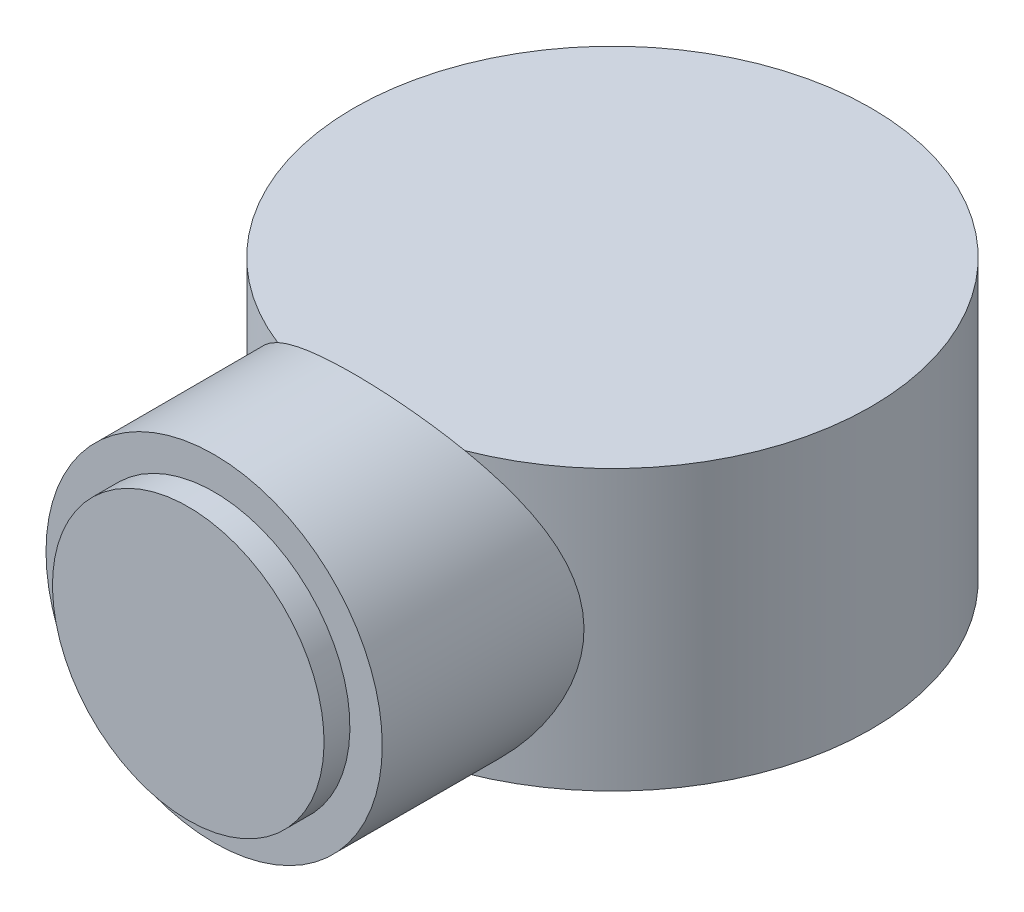
ISO-10303-21;
HEADER;
FILE_DESCRIPTION(('STEP AP214'),'2;1');
FILE_NAME('part.step','',(''),(''),'','','');
FILE_SCHEMA(('AUTOMOTIVE_DESIGN { 1 0 10303 214 1 1 1 1 }'));
ENDSEC;
DATA;
#1=APPLICATION_CONTEXT('core data for automotive mechanical design processes');
#2=APPLICATION_PROTOCOL_DEFINITION('international standard','automotive_design',2000,#1);
#3=PRODUCT_CONTEXT('',#1,'mechanical');
#4=PRODUCT('Part','Part','',(#3));
#5=PRODUCT_RELATED_PRODUCT_CATEGORY('part','',(#4));
#6=PRODUCT_DEFINITION_FORMATION('','',#4);
#7=PRODUCT_DEFINITION_CONTEXT('part definition',#1,'design');
#8=PRODUCT_DEFINITION('design','',#6,#7);
#9=PRODUCT_DEFINITION_SHAPE('','',#8);
#10=(LENGTH_UNIT() NAMED_UNIT(*) SI_UNIT(.MILLI.,.METRE.));
#11=(NAMED_UNIT(*) PLANE_ANGLE_UNIT() SI_UNIT($,.RADIAN.));
#12=(NAMED_UNIT(*) SI_UNIT($,.STERADIAN.) SOLID_ANGLE_UNIT());
#13=UNCERTAINTY_MEASURE_WITH_UNIT(LENGTH_MEASURE(1.E-05),#10,'distance_accuracy_value','');
#14=(GEOMETRIC_REPRESENTATION_CONTEXT(3) GLOBAL_UNCERTAINTY_ASSIGNED_CONTEXT((#13)) GLOBAL_UNIT_ASSIGNED_CONTEXT((#10,
#11,#12)) REPRESENTATION_CONTEXT('',''));
#15=CARTESIAN_POINT('',(0.,0.,0.));
#16=DIRECTION('',(0.,0.,1.));
#17=DIRECTION('',(1.,0.,0.));
#18=AXIS2_PLACEMENT_3D('',#15,#16,#17);
#19=CARTESIAN_POINT('',(0.,26.9999999999997,-82.0000000000001));
#20=DIRECTION('',(0.,-1.,0.));
#21=DIRECTION('',(0.,0.,-1.));
#22=AXIS2_PLACEMENT_3D('',#19,#20,#21);
#23=CYLINDRICAL_SURFACE('',#22,50.);
#24=CARTESIAN_POINT('',(0.,26.9999999999997,-82.0000000000001));
#25=DIRECTION('',(0.,1.,0.));
#26=DIRECTION('',(0.,0.,1.));
#27=AXIS2_PLACEMENT_3D('',#24,#25,#26);
#28=CIRCLE('',#27,50.);
#29=CARTESIAN_POINT('',(18.0900525151256,26.9999999999998,-35.3872335084047));
#30=VERTEX_POINT('',#29);
#31=CARTESIAN_POINT('',(-18.0900525151254,26.9999999999999,-35.3872335084047));
#32=VERTEX_POINT('',#31);
#33=EDGE_CURVE('E50',#30,#32,#28,.T.);
#34=ORIENTED_EDGE('',*,*,#33,.F.);
#35=CARTESIAN_POINT('',(-1.13473143512402E-13,-32.5000000000001,-31.9999999999999));
#36=CARTESIAN_POINT('',(0.820379898340694,-32.4999946604606,-32.0000049167048));
#37=CARTESIAN_POINT('',(1.64084726886588,-32.4688918351984,-32.0202374373917));
#38=CARTESIAN_POINT('',(3.2751762756967,-32.3449393474643,-32.1006720952423));
#39=CARTESIAN_POINT('',(4.08903698480223,-32.2520811646673,-32.1608797477331));
#40=CARTESIAN_POINT('',(5.70432342494334,-32.0059151643631,-32.3198251772717));
#41=CARTESIAN_POINT('',(6.50573980179255,-31.8525639639237,-32.4185906057345));
#42=CARTESIAN_POINT('',(8.08972592140912,-31.4875684982053,-32.6522813261397));
#43=CARTESIAN_POINT('',(8.87229605208647,-31.2759254338576,-32.7872058731288));
#44=CARTESIAN_POINT('',(10.4098909799679,-30.7982018457091,-33.0894162980081));
#45=CARTESIAN_POINT('',(11.1650299429452,-30.5323874376161,-33.2565437688202));
#46=CARTESIAN_POINT('',(12.6475670057982,-29.9486858544309,-33.6200284366547));
#47=CARTESIAN_POINT('',(13.374965041266,-29.6307985584469,-33.8163857015366));
#48=CARTESIAN_POINT('',(14.7986574365593,-28.9460483734247,-34.2344246381361));
#49=CARTESIAN_POINT('',(15.494953131867,-28.5791875899287,-34.4561052210563));
#50=CARTESIAN_POINT('',(16.8538667718529,-27.799477265193,-34.9206743156437));
#51=CARTESIAN_POINT('',(17.5164831418726,-27.3866255765486,-35.163563817482));
#52=CARTESIAN_POINT('',(18.8594396012603,-26.4816990798439,-35.6871177325799));
#53=CARTESIAN_POINT('',(19.5366956160192,-25.9858940080825,-35.969244460599));
#54=CARTESIAN_POINT('',(20.8472210237897,-24.9467995869057,-36.5477556058696));
#55=CARTESIAN_POINT('',(21.4804884457185,-24.4035081121343,-36.8441406610161));
#56=CARTESIAN_POINT('',(22.7021098692217,-23.2714119961403,-37.4457818290953));
#57=CARTESIAN_POINT('',(23.2904045982317,-22.6825492813086,-37.7510489413016));
#58=CARTESIAN_POINT('',(24.4195865043335,-21.4621757603438,-38.364044794848));
#59=CARTESIAN_POINT('',(24.9604708916953,-20.8306624484205,-38.6717736798831));
#60=CARTESIAN_POINT('',(26.0700560672087,-19.4297480882362,-39.3288469841465));
#61=CARTESIAN_POINT('',(26.6309119255251,-18.653814986827,-39.6775672126893));
#62=CARTESIAN_POINT('',(27.6848953678642,-17.0504295522224,-40.3593868787113));
#63=CARTESIAN_POINT('',(28.1780086711108,-16.2229664092713,-40.6924830127657));
#64=CARTESIAN_POINT('',(29.0919462219695,-14.5203624327402,-41.330982131012));
#65=CARTESIAN_POINT('',(29.5128689906528,-13.6452887597829,-41.6364225846317));
#66=CARTESIAN_POINT('',(30.2783525612671,-11.8500015135485,-42.2074184184832));
#67=CARTESIAN_POINT('',(30.6229480570223,-10.9298086820174,-42.4729919020971));
#68=CARTESIAN_POINT('',(31.1461312138078,-9.31014237881203,-42.8848292430151));
#69=CARTESIAN_POINT('',(31.3442611136037,-8.62015210273488,-43.0437630440795));
#70=CARTESIAN_POINT('',(31.695564794545,-7.22220724043643,-43.3290487455707));
#71=CARTESIAN_POINT('',(31.848745876524,-6.51425559191773,-43.455405936864));
#72=CARTESIAN_POINT('',(32.1079075043085,-5.08516204207173,-43.6710193571039));
#73=CARTESIAN_POINT('',(32.213952486247,-4.36403955919741,-43.7603262234888));
#74=CARTESIAN_POINT('',(32.3774801531489,-2.91241765501982,-43.8986832812475));
#75=CARTESIAN_POINT('',(32.4349623959195,-2.18191814839461,-43.9477331060566));
#76=CARTESIAN_POINT('',(32.5004721086949,-0.714519654845074,-44.0036683135096));
#77=CARTESIAN_POINT('',(32.508326850756,0.0223927537602779,-44.0104064302437));
#78=CARTESIAN_POINT('',(32.4739783985208,1.49418381539327,-43.9810413878418));
#79=CARTESIAN_POINT('',(32.4317749743356,2.22906245906543,-43.9449380319589));
#80=CARTESIAN_POINT('',(32.298017031725,3.69158169889369,-43.831351570657));
#81=CARTESIAN_POINT('',(32.2064265315172,4.41921662337202,-43.7538382957283));
#82=CARTESIAN_POINT('',(31.9753805209268,5.86162203348548,-43.56046783901));
#83=CARTESIAN_POINT('',(31.8359240348907,6.57639225658648,-43.4446098756414));
#84=CARTESIAN_POINT('',(31.5168911106297,7.96394669363381,-43.18342571277));
#85=CARTESIAN_POINT('',(31.33890276179,8.63732267043122,-43.0392826646007));
#86=CARTESIAN_POINT('',(30.9421702821062,9.96557873289969,-42.7234631624777));
#87=CARTESIAN_POINT('',(30.7234102485866,10.620451486365,-42.551775968796));
#88=CARTESIAN_POINT('',(30.247135742793,11.9093625725823,-42.1854173593476));
#89=CARTESIAN_POINT('',(29.9896169137431,12.5433985533526,-41.9907433602244));
#90=CARTESIAN_POINT('',(29.437755646684,13.788851456104,-41.5829711941545));
#91=CARTESIAN_POINT('',(29.1434216844658,14.4002735425391,-41.3698772714254));
#92=CARTESIAN_POINT('',(28.4578175430331,15.7180777586584,-40.8859920618145));
#93=CARTESIAN_POINT('',(28.0588852943436,16.4193502974396,-40.6121202361153));
#94=CARTESIAN_POINT('',(27.2127893027469,17.7865262043893,-40.0509612508381));
#95=CARTESIAN_POINT('',(26.765621011416,18.4524262282508,-39.7636728275912));
#96=CARTESIAN_POINT('',(25.8244717865272,19.7481253404722,-39.1817438756004));
#97=CARTESIAN_POINT('',(25.3304405201311,20.3778844200846,-38.8870956981124));
#98=CARTESIAN_POINT('',(24.2975913742117,21.5989955295086,-38.2966705070723));
#99=CARTESIAN_POINT('',(23.7587706814012,22.1903451426052,-38.000893423727));
#100=CARTESIAN_POINT('',(22.5286511323824,23.4440586838089,-37.3566242838898));
#101=CARTESIAN_POINT('',(21.8280825337456,24.0978541444605,-37.0090723471828));
#102=CARTESIAN_POINT('',(20.3674410882345,25.3444130595284,-36.3292610769504));
#103=CARTESIAN_POINT('',(19.6073579505352,25.9371659176912,-35.9970044040135));
#104=CARTESIAN_POINT('',(18.0313075910059,27.0565210365043,-35.3567282303878));
#105=CARTESIAN_POINT('',(17.2153866190106,27.5831770437383,-35.0486891143736));
#106=CARTESIAN_POINT('',(15.5310138918831,28.5654939457797,-34.4649454465222));
#107=CARTESIAN_POINT('',(14.6625768219425,29.0211745613143,-34.1892319182063));
#108=CARTESIAN_POINT('',(13.0551073362085,29.7731104756529,-33.7287010780984));
#109=CARTESIAN_POINT('',(12.3245141684951,30.0830659962703,-33.5366966822638));
#110=CARTESIAN_POINT('',(10.8362739804482,30.6505975880766,-33.182380766659));
#111=CARTESIAN_POINT('',(10.0786302616408,30.9081800258952,-33.0200656380131));
#112=CARTESIAN_POINT('',(8.54098217221512,31.3678991154419,-32.7286746582167));
#113=CARTESIAN_POINT('',(7.76099287899609,31.5700722240385,-32.5995769549184));
#114=CARTESIAN_POINT('',(6.18317573262204,31.9166205684596,-32.377394603565));
#115=CARTESIAN_POINT('',(5.38534756845962,32.060994795773,-32.2843105839002));
#116=CARTESIAN_POINT('',(3.77460108589346,32.2903482323194,-32.1360963797553));
#117=CARTESIAN_POINT('',(2.96163742912222,32.3751028808244,-32.0811097027845));
#118=CARTESIAN_POINT('',(1.32990448445428,32.483070605669,-32.0110193960489));
#119=CARTESIAN_POINT('',(0.511135193091318,32.5062836452619,-31.9959157900984));
#120=CARTESIAN_POINT('',(-1.1255870277293,32.4908120509777,-32.0059719829758));
#121=CARTESIAN_POINT('',(-1.94353993430049,32.4521257280264,-32.0311328805183));
#122=CARTESIAN_POINT('',(-3.57199749573222,32.3134426463782,-32.1210887422933));
#123=CARTESIAN_POINT('',(-4.38250238560955,32.2134478290157,-32.1858824515519));
#124=CARTESIAN_POINT('',(-5.94197489256977,31.9613719584213,-32.348508152962));
#125=CARTESIAN_POINT('',(-6.69173502687869,31.812743237299,-32.4441454943771));
#126=CARTESIAN_POINT('',(-8.17442826276929,31.4644026294862,-32.6670422514225));
#127=CARTESIAN_POINT('',(-8.90736217279689,31.2646932026804,-32.794300144299));
#128=CARTESIAN_POINT('',(-10.352356191755,30.8164089830272,-33.0779094566633));
#129=CARTESIAN_POINT('',(-11.0644149966382,30.5678311448612,-33.2342626892445));
#130=CARTESIAN_POINT('',(-12.4641703227048,30.0242943573913,-33.5731158167226));
#131=CARTESIAN_POINT('',(-13.1518655155655,29.7293328839698,-33.7556171345053));
#132=CARTESIAN_POINT('',(-14.5468935746807,29.0735703190451,-34.1570209613954));
#133=CARTESIAN_POINT('',(-15.252269797498,28.7096182026578,-34.3775717859257));
#134=CARTESIAN_POINT('',(-16.6290978651479,27.9346965691567,-34.8406873777292));
#135=CARTESIAN_POINT('',(-17.3005484816244,27.5237253513625,-35.0832529412098));
#136=CARTESIAN_POINT('',(-18.6077424208219,26.6574027719116,-35.5861805510769));
#137=CARTESIAN_POINT('',(-19.2434646350103,26.2020256005708,-35.8465529205846));
#138=CARTESIAN_POINT('',(-20.4770764710834,25.2496858797038,-36.3804738560831));
#139=CARTESIAN_POINT('',(-21.074964032645,24.7527210688984,-36.6540231382094));
#140=CARTESIAN_POINT('',(-22.321317368383,23.639192181752,-37.252843682321));
#141=CARTESIAN_POINT('',(-22.9632199419751,23.0160396905247,-37.5795503511867));
#142=CARTESIAN_POINT('',(-24.1926746957851,21.7200933671886,-38.236995413044));
#143=CARTESIAN_POINT('',(-24.7802192169113,21.0472925635289,-38.5677343667799));
#144=CARTESIAN_POINT('',(-25.8990740511105,19.6541722015348,-39.2254838007625));
#145=CARTESIAN_POINT('',(-26.4303596241355,18.9338319617478,-39.5524925847178));
#146=CARTESIAN_POINT('',(-27.4339387672869,17.4479953540767,-40.1940958591796));
#147=CARTESIAN_POINT('',(-27.906240523045,16.6825052737353,-40.5086920681187));
#148=CARTESIAN_POINT('',(-28.7362441351098,15.2022955754751,-41.0799435184752));
#149=CARTESIAN_POINT('',(-29.1008956870287,14.4924109597111,-41.3390340078335));
#150=CARTESIAN_POINT('',(-29.779672463042,13.0408179524925,-41.8335034912016));
#151=CARTESIAN_POINT('',(-30.0937987375457,12.2991102230395,-42.0688829781197));
#152=CARTESIAN_POINT('',(-30.6681484086004,10.7873745813625,-42.5082879424085));
#153=CARTESIAN_POINT('',(-30.9284517177363,10.0173906827654,-42.712359785226));
#154=CARTESIAN_POINT('',(-31.3924770297741,8.45155190181633,-43.0821299226558));
#155=CARTESIAN_POINT('',(-31.5962093331374,7.65570175871323,-43.2478352021462));
#156=CARTESIAN_POINT('',(-31.9176987315613,6.16453252501401,-43.512378132063));
#157=CARTESIAN_POINT('',(-32.0437830280959,5.47212394851011,-43.6175278313672));
#158=CARTESIAN_POINT('',(-32.2510939378217,4.07611127999872,-43.7915536732076));
#159=CARTESIAN_POINT('',(-32.3323254043466,3.37250840775805,-43.860433740289));
#160=CARTESIAN_POINT('',(-32.4486339223221,1.95921823178998,-43.9593371405169));
#161=CARTESIAN_POINT('',(-32.4837410292135,1.24953519380484,-43.9893857766947));
#162=CARTESIAN_POINT('',(-32.5073136396741,-0.171197109053113,-44.0095430908793));
#163=CARTESIAN_POINT('',(-32.495778141635,-0.882246402937328,-43.9996509111929));
#164=CARTESIAN_POINT('',(-32.4262861105484,-2.29982422797207,-43.940336116817));
#165=CARTESIAN_POINT('',(-32.368366474764,-3.00635590265116,-43.8909449225144));
#166=CARTESIAN_POINT('',(-32.2070967599132,-4.41048628433351,-43.7545558768914));
#167=CARTESIAN_POINT('',(-32.1037471090555,-5.10808507547148,-43.6675583800359));
#168=CARTESIAN_POINT('',(-31.8530019051811,-6.49080522575601,-43.4589464778434));
#169=CARTESIAN_POINT('',(-31.7055585145022,-7.17591217152205,-43.337294482391));
#170=CARTESIAN_POINT('',(-31.3685451393115,-8.52941967219312,-43.0633662919892));
#171=CARTESIAN_POINT('',(-31.1789696552475,-9.19781803342414,-42.9110860993516));
#172=CARTESIAN_POINT('',(-30.6982762499882,-10.708144171934,-42.5318484137882));
#173=CARTESIAN_POINT('',(-30.3936788069919,-11.5435910331389,-42.2960798242747));
#174=CARTESIAN_POINT('',(-29.721538113857,-13.178073450673,-41.7904626452168));
#175=CARTESIAN_POINT('',(-29.3539769517075,-13.9770985635685,-41.5206043635387));
#176=CARTESIAN_POINT('',(-28.5591694410699,-15.5367537053814,-40.9559789082757));
#177=CARTESIAN_POINT('',(-28.1318599644147,-16.297341950643,-40.6611855209229));
#178=CARTESIAN_POINT('',(-27.2208981243105,-17.7771671723012,-40.0557299298605));
#179=CARTESIAN_POINT('',(-26.7372491465868,-18.4964066296799,-39.7450686803604));
#180=CARTESIAN_POINT('',(-25.7080858845503,-19.9026430028615,-39.1110124550416));
#181=CARTESIAN_POINT('',(-25.1617288893836,-20.5889673674954,-38.7874947431435));
#182=CARTESIAN_POINT('',(-24.0154817005351,-21.9151731201872,-38.1401103282432));
#183=CARTESIAN_POINT('',(-23.4155912275828,-22.5550542659309,-37.8162436234292));
#184=CARTESIAN_POINT('',(-22.1639850361143,-23.7860962120972,-37.1753172955864));
#185=CARTESIAN_POINT('',(-21.5122559491887,-24.3772443644408,-36.8582594554097));
#186=CARTESIAN_POINT('',(-20.159035723767,-25.5076576632532,-36.2379262664145));
#187=CARTESIAN_POINT('',(-19.4575420645244,-26.0469201782714,-35.9346516170402));
#188=CARTESIAN_POINT('',(-17.9339091298917,-27.1215603088252,-35.3189979478375));
#189=CARTESIAN_POINT('',(-17.106735038787,-27.6510744709069,-35.0087792540089));
#190=CARTESIAN_POINT('',(-15.3986971256462,-28.6374401645391,-34.4216861173291));
#191=CARTESIAN_POINT('',(-14.5178252189716,-29.0942807169332,-34.144816714249));
#192=CARTESIAN_POINT('',(-12.7092691977612,-29.9284719837868,-33.6331206576607));
#193=CARTESIAN_POINT('',(-11.7816757386605,-30.3059698030428,-33.3982163227002));
#194=CARTESIAN_POINT('',(-10.3602514667508,-30.8085707215797,-33.0827103859269));
#195=CARTESIAN_POINT('',(-9.8814922191075,-30.9654829117465,-32.9836924014679));
#196=CARTESIAN_POINT('',(-8.91476468347592,-31.2575090319509,-32.7986883725901));
#197=CARTESIAN_POINT('',(-8.42679489185511,-31.3926193678232,-32.7127044770596));
#198=CARTESIAN_POINT('',(-7.29205135260549,-31.6783091749284,-32.530315263328));
#199=CARTESIAN_POINT('',(-6.64246283534791,-31.8209288907621,-32.4387986214879));
#200=CARTESIAN_POINT('',(-5.33292853081838,-32.0663938081108,-32.2808407746721));
#201=CARTESIAN_POINT('',(-4.67298455917702,-32.1692459027955,-32.214395224016));
#202=CARTESIAN_POINT('',(-3.34607343613194,-32.3342013612083,-32.1076497961599));
#203=CARTESIAN_POINT('',(-2.67910815486166,-32.3963153098609,-32.0673431273683));
#204=CARTESIAN_POINT('',(-1.34144848399063,-32.4792203284978,-32.0135139400885));
#205=CARTESIAN_POINT('',(-0.670753479198402,-32.5000043656784,-31.9999959800368));
#206=CARTESIAN_POINT('',(-1.13473143512402E-13,-32.5000000000001,-31.9999999999999));
#207=B_SPLINE_CURVE_WITH_KNOTS('',3,(#35,#36,#37,#38,#39,#40,#41,#42,#43,#44,#45,#46,#47,#48,
#49,#50,#51,#52,#53,#54,#55,#56,#57,#58,#59,#60,#61,#62,#63,#64,#65,#66,#67,#68,#69,#70,#71,#72,
#73,#74,#75,#76,#77,#78,#79,#80,#81,#82,#83,#84,#85,#86,#87,#88,#89,#90,#91,#92,#93,#94,#95,#96,
#97,#98,#99,#100,#101,#102,#103,#104,#105,#106,#107,#108,#109,#110,#111,#112,#113,#114,#115,
#116,#117,#118,#119,#120,#121,#122,#123,#124,#125,#126,#127,#128,#129,#130,#131,#132,#133,#134,
#135,#136,#137,#138,#139,#140,#141,#142,#143,#144,#145,#146,#147,#148,#149,#150,#151,#152,#153,
#154,#155,#156,#157,#158,#159,#160,#161,#162,#163,#164,#165,#166,#167,#168,#169,#170,#171,#172,
#173,#174,#175,#176,#177,#178,#179,#180,#181,#182,#183,#184,#185,#186,#187,#188,#189,#190,#191,
#192,#193,#194,#195,#196,#197,#198,#199,#200,#201,#202,#203,#204,#205,#206),.UNSPECIFIED.,.T.,
.F.,(4,2,2,2,2,2,2,2,2,2,2,2,2,2,2,2,2,2,2,2,2,2,2,2,2,2,2,2,2,2,2,2,2,2,2,2,2,2,2,2,2,2,2,2,2,
2,2,2,2,2,2,2,2,2,2,2,2,2,2,2,2,2,2,2,2,2,2,2,2,2,2,2,2,2,2,2,2,2,2,2,2,2,2,2,2,4),(0.,
2.46045993003765,4.92125939771797,7.38382686034164,9.84634359284154,12.2970428769451,
14.7477478506417,17.1983474938338,19.6490616082807,22.3029292718831,24.9569157759163,
27.6143419106252,30.2719243093767,33.3251156223354,36.3789495926578,39.4285821341122,
42.4768256369194,44.6805266408033,46.8838695090903,49.0841910232989,51.2845325725393,
53.4925281856819,55.7005339389497,57.9101505497284,60.1198122018549,62.2515577277178,
64.3841364708946,66.5169551110068,68.6492836220793,71.2029639599346,73.7568853082476,
76.3135814239512,78.8704382508674,81.924762038273,84.9796151285971,88.031967848395,
91.0834709439922,93.5305607781958,95.9773529586959,98.4225313729449,100.867752450345,
103.322134985925,105.776518987026,108.230969963086,110.685343222929,112.993712174889,
115.301969984042,117.61037168185,119.918899042404,122.38786060554,124.85691149924,
127.327406109676,129.798035137756,132.652317947386,135.507002317129,138.362936875042,
141.218474651779,143.733409825373,146.248292707263,148.759414421274,151.270078609418,
153.402630947015,155.534952484961,157.665883874566,159.796861024257,161.926144723967,
164.055408354168,166.186990472554,168.318850992474,171.074796064786,173.83152645837,
176.591191849729,179.35069148432,182.152963084706,184.955249304694,187.758260550462,
190.5614138799,193.646940868185,196.73293356028,199.813153211307,201.352923022289,
202.892946414719,204.905180739947,206.91706611552,208.928428538954,210.940133191687),.UNSPECIFIED.);
#208=CARTESIAN_POINT('',(18.0900525151254,-27.0000000000002,-35.3872335084045));
#209=VERTEX_POINT('',#208);
#210=EDGE_CURVE('E77',#209,#30,#207,.T.);
#211=ORIENTED_EDGE('',*,*,#210,.F.);
#212=CARTESIAN_POINT('',(0.,-27.0000000000003,-81.9999999999999));
#213=DIRECTION('',(0.,1.,0.));
#214=DIRECTION('',(0.,0.,1.));
#215=AXIS2_PLACEMENT_3D('',#212,#213,#214);
#216=CIRCLE('',#215,50.);
#217=CARTESIAN_POINT('',(-18.0900525151256,-27.0000000000001,-35.3872335084045));
#218=VERTEX_POINT('',#217);
#219=EDGE_CURVE('E45',#209,#218,#216,.T.);
#220=ORIENTED_EDGE('',*,*,#219,.T.);
#221=EDGE_CURVE('E58',#32,#218,#207,.T.);
#222=ORIENTED_EDGE('',*,*,#221,.F.);
#223=EDGE_LOOP('',(#34,#211,#220,#222));
#224=FACE_BOUND('',#223,.T.);
#225=ADVANCED_FACE('F42',(#224),#23,.T.);
#226=CARTESIAN_POINT('',(0.,26.9999999999997,-82.0000000000001));
#227=DIRECTION('',(0.,1.,0.));
#228=DIRECTION('',(0.,0.,1.));
#229=AXIS2_PLACEMENT_3D('',#226,#227,#228);
#230=PLANE('',#229);
#231=ORIENTED_EDGE('',*,*,#33,.T.);
#232=CARTESIAN_POINT('',(0.,26.9999999999997,-82.0000000000001));
#233=DIRECTION('',(0.,1.,0.));
#234=DIRECTION('',(0.,0.,1.));
#235=AXIS2_PLACEMENT_3D('',#232,#233,#234);
#236=CIRCLE('',#235,50.);
#237=EDGE_CURVE('E64',#30,#32,#236,.F.);
#238=ORIENTED_EDGE('',*,*,#237,.F.);
#239=EDGE_LOOP('',(#231,#238));
#240=FACE_BOUND('',#239,.T.);
#241=ADVANCED_FACE('F120',(#240),#230,.T.);
#242=CARTESIAN_POINT('',(0.,-27.0000000000003,-81.9999999999999));
#243=DIRECTION('',(0.,1.,0.));
#244=DIRECTION('',(0.,0.,1.));
#245=AXIS2_PLACEMENT_3D('',#242,#243,#244);
#246=PLANE('',#245);
#247=ORIENTED_EDGE('',*,*,#219,.F.);
#248=EDGE_CURVE('E74',#218,#209,#216,.T.);
#249=ORIENTED_EDGE('',*,*,#248,.F.);
#250=EDGE_LOOP('',(#247,#249));
#251=FACE_BOUND('',#250,.T.);
#252=ADVANCED_FACE('F72',(#251),#246,.F.);
#253=CARTESIAN_POINT('',(0.,26.9999999999997,-82.0000000000001));
#254=DIRECTION('',(0.,-1.,0.));
#255=DIRECTION('',(0.,0.,-1.));
#256=AXIS2_PLACEMENT_3D('',#253,#254,#255);
#257=CYLINDRICAL_SURFACE('',#256,50.);
#258=ORIENTED_EDGE('',*,*,#248,.T.);
#259=EDGE_CURVE('E84',#218,#209,#207,.T.);
#260=ORIENTED_EDGE('',*,*,#259,.F.);
#261=EDGE_LOOP('',(#258,#260));
#262=FACE_BOUND('',#261,.T.);
#263=ADVANCED_FACE('F86',(#262),#257,.F.);
#264=CARTESIAN_POINT('',(0.,0.,-5.));
#265=DIRECTION('',(0.,0.,1.));
#266=DIRECTION('',(0.,-1.,0.));
#267=AXIS2_PLACEMENT_3D('',#264,#265,#266);
#268=PLANE('',#267);
#269=CARTESIAN_POINT('',(0.,0.,-5.));
#270=DIRECTION('',(0.,0.,1.));
#271=DIRECTION('',(0.,-1.,0.));
#272=AXIS2_PLACEMENT_3D('',#269,#270,#271);
#273=CIRCLE('',#272,26.25);
#274=CARTESIAN_POINT('',(0.,-26.25,-4.99999999999991));
#275=VERTEX_POINT('',#274);
#276=EDGE_CURVE('E11',#275,#275,#273,.T.);
#277=ORIENTED_EDGE('',*,*,#276,.F.);
#278=EDGE_LOOP('',(#277));
#279=FACE_BOUND('',#278,.T.);
#280=CARTESIAN_POINT('',(0.,0.,-5.));
#281=DIRECTION('',(0.,0.,1.));
#282=DIRECTION('',(0.,-1.,0.));
#283=AXIS2_PLACEMENT_3D('',#280,#281,#282);
#284=CIRCLE('',#283,32.5);
#285=CARTESIAN_POINT('',(-1.13473143512402E-13,-32.5,-4.99999999999989));
#286=VERTEX_POINT('',#285);
#287=EDGE_CURVE('E88',#286,#286,#284,.T.);
#288=ORIENTED_EDGE('',*,*,#287,.T.);
#289=EDGE_LOOP('',(#288));
#290=FACE_BOUND('',#289,.T.);
#291=ADVANCED_FACE('F106',(#279,#290),#268,.T.);
#292=CARTESIAN_POINT('',(0.,-4.60879028208632E-13,-132.001));
#293=DIRECTION('',(0.,0.,1.));
#294=DIRECTION('',(0.,-1.,0.));
#295=AXIS2_PLACEMENT_3D('',#292,#293,#294);
#296=CYLINDRICAL_SURFACE('',#295,32.5);
#297=ORIENTED_EDGE('',*,*,#287,.F.);
#298=EDGE_LOOP('',(#297));
#299=FACE_BOUND('',#298,.T.);
#300=ORIENTED_EDGE('',*,*,#210,.T.);
#301=EDGE_CURVE('E82',#30,#32,#207,.T.);
#302=ORIENTED_EDGE('',*,*,#301,.T.);
#303=ORIENTED_EDGE('',*,*,#221,.T.);
#304=ORIENTED_EDGE('',*,*,#259,.T.);
#305=EDGE_LOOP('',(#300,#302,#303,#304));
#306=FACE_BOUND('',#305,.T.);
#307=ADVANCED_FACE('F87',(#299,#306),#296,.T.);
#308=ORIENTED_EDGE('',*,*,#301,.F.);
#309=ORIENTED_EDGE('',*,*,#237,.T.);
#310=EDGE_LOOP('',(#308,#309));
#311=FACE_BOUND('',#310,.T.);
#312=ADVANCED_FACE('F100',(#311),#257,.F.);
#313=CARTESIAN_POINT('',(0.,0.,0.));
#314=DIRECTION('',(0.,0.,-1.));
#315=DIRECTION('',(0.,1.,0.));
#316=AXIS2_PLACEMENT_3D('',#313,#314,#315);
#317=CYLINDRICAL_SURFACE('',#316,26.25);
#318=CARTESIAN_POINT('',(0.,0.,0.));
#319=DIRECTION('',(0.,0.,1.));
#320=DIRECTION('',(0.,-1.,0.));
#321=AXIS2_PLACEMENT_3D('',#318,#319,#320);
#322=CIRCLE('',#321,26.25);
#323=CARTESIAN_POINT('',(0.,-26.25,0.));
#324=VERTEX_POINT('',#323);
#325=EDGE_CURVE('E90',#324,#324,#322,.T.);
#326=ORIENTED_EDGE('',*,*,#325,.F.);
#327=EDGE_LOOP('',(#326));
#328=FACE_BOUND('',#327,.T.);
#329=ORIENTED_EDGE('',*,*,#276,.T.);
#330=EDGE_LOOP('',(#329));
#331=FACE_BOUND('',#330,.T.);
#332=ADVANCED_FACE('F104',(#328,#331),#317,.T.);
#333=CARTESIAN_POINT('',(0.,0.,0.));
#334=DIRECTION('',(0.,0.,1.));
#335=DIRECTION('',(0.,-1.,0.));
#336=AXIS2_PLACEMENT_3D('',#333,#334,#335);
#337=PLANE('',#336);
#338=ORIENTED_EDGE('',*,*,#325,.T.);
#339=EDGE_LOOP('',(#338));
#340=FACE_BOUND('',#339,.T.);
#341=ADVANCED_FACE('F112',(#340),#337,.T.);
#342=CLOSED_SHELL('',(#225,#241,#252,#263,#291,#307,#312,#332,#341));
#343=MANIFOLD_SOLID_BREP('B2',#342);
#344=ADVANCED_BREP_SHAPE_REPRESENTATION('',(#18,#343),#14);
#345=SHAPE_DEFINITION_REPRESENTATION(#9,#344);
ENDSEC;
END-ISO-10303-21;
